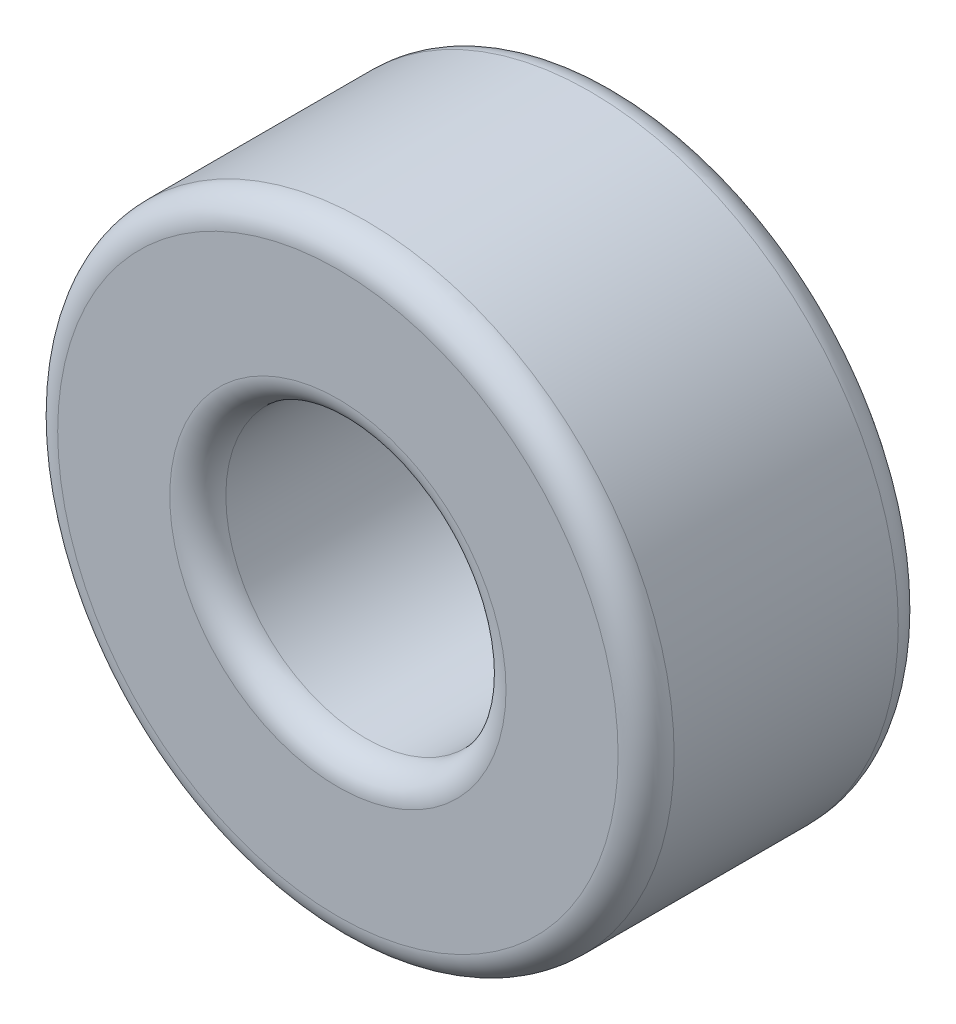
ISO-10303-21;
HEADER;
FILE_DESCRIPTION(('STEP AP214'),'2;1');
FILE_NAME('part.step','',(''),(''),'','','');
FILE_SCHEMA(('AUTOMOTIVE_DESIGN { 1 0 10303 214 1 1 1 1 }'));
ENDSEC;
DATA;
#1=APPLICATION_CONTEXT('core data for automotive mechanical design processes');
#2=APPLICATION_PROTOCOL_DEFINITION('international standard','automotive_design',2000,#1);
#3=PRODUCT_CONTEXT('',#1,'mechanical');
#4=PRODUCT('Part','Part','',(#3));
#5=PRODUCT_RELATED_PRODUCT_CATEGORY('part','',(#4));
#6=PRODUCT_DEFINITION_FORMATION('','',#4);
#7=PRODUCT_DEFINITION_CONTEXT('part definition',#1,'design');
#8=PRODUCT_DEFINITION('design','',#6,#7);
#9=PRODUCT_DEFINITION_SHAPE('','',#8);
#10=(LENGTH_UNIT() NAMED_UNIT(*) SI_UNIT(.MILLI.,.METRE.));
#11=(NAMED_UNIT(*) PLANE_ANGLE_UNIT() SI_UNIT($,.RADIAN.));
#12=(NAMED_UNIT(*) SI_UNIT($,.STERADIAN.) SOLID_ANGLE_UNIT());
#13=UNCERTAINTY_MEASURE_WITH_UNIT(LENGTH_MEASURE(1.E-05),#10,'distance_accuracy_value','');
#14=(GEOMETRIC_REPRESENTATION_CONTEXT(3) GLOBAL_UNCERTAINTY_ASSIGNED_CONTEXT((#13)) GLOBAL_UNIT_ASSIGNED_CONTEXT((#10,
#11,#12)) REPRESENTATION_CONTEXT('',''));
#15=CARTESIAN_POINT('',(0.,0.,0.));
#16=DIRECTION('',(0.,0.,1.));
#17=DIRECTION('',(1.,0.,0.));
#18=AXIS2_PLACEMENT_3D('',#15,#16,#17);
#19=CARTESIAN_POINT('',(0.,0.,5.));
#20=DIRECTION('',(0.,0.,1.));
#21=DIRECTION('',(1.,0.,0.));
#22=AXIS2_PLACEMENT_3D('',#19,#20,#21);
#23=PLANE('',#22);
#24=CARTESIAN_POINT('',(0.,0.,5.));
#25=DIRECTION('',(0.,0.,1.));
#26=DIRECTION('',(1.,0.,0.));
#27=AXIS2_PLACEMENT_3D('',#24,#25,#26);
#28=CIRCLE('',#27,3.);
#29=CARTESIAN_POINT('',(3.,0.,5.));
#30=VERTEX_POINT('',#29);
#31=EDGE_CURVE('E10',#30,#30,#28,.F.);
#32=ORIENTED_EDGE('',*,*,#31,.T.);
#33=EDGE_LOOP('',(#32));
#34=FACE_BOUND('',#33,.T.);
#35=CARTESIAN_POINT('',(0.,0.,5.));
#36=DIRECTION('',(0.,0.,1.));
#37=DIRECTION('',(1.,0.,0.));
#38=AXIS2_PLACEMENT_3D('',#35,#36,#37);
#39=CIRCLE('',#38,5.);
#40=CARTESIAN_POINT('',(5.,0.,5.));
#41=VERTEX_POINT('',#40);
#42=EDGE_CURVE('E39',#41,#41,#39,.T.);
#43=ORIENTED_EDGE('',*,*,#42,.T.);
#44=EDGE_LOOP('',(#43));
#45=FACE_BOUND('',#44,.T.);
#46=ADVANCED_FACE('F32',(#34,#45),#23,.T.);
#47=CARTESIAN_POINT('',(0.,0.,0.));
#48=DIRECTION('',(0.,0.,1.));
#49=DIRECTION('',(1.,0.,0.));
#50=AXIS2_PLACEMENT_3D('',#47,#48,#49);
#51=PLANE('',#50);
#52=CARTESIAN_POINT('',(0.,0.,0.));
#53=DIRECTION('',(0.,0.,1.));
#54=DIRECTION('',(1.,0.,0.));
#55=AXIS2_PLACEMENT_3D('',#52,#53,#54);
#56=CIRCLE('',#55,3.);
#57=CARTESIAN_POINT('',(3.,0.,0.));
#58=VERTEX_POINT('',#57);
#59=EDGE_CURVE('E58',#58,#58,#56,.T.);
#60=ORIENTED_EDGE('',*,*,#59,.T.);
#61=EDGE_LOOP('',(#60));
#62=FACE_BOUND('',#61,.T.);
#63=CARTESIAN_POINT('',(0.,0.,0.));
#64=DIRECTION('',(0.,0.,1.));
#65=DIRECTION('',(1.,0.,0.));
#66=AXIS2_PLACEMENT_3D('',#63,#64,#65);
#67=CIRCLE('',#66,5.);
#68=CARTESIAN_POINT('',(5.,0.,0.));
#69=VERTEX_POINT('',#68);
#70=EDGE_CURVE('E61',#69,#69,#67,.F.);
#71=ORIENTED_EDGE('',*,*,#70,.T.);
#72=EDGE_LOOP('',(#71));
#73=FACE_BOUND('',#72,.T.);
#74=ADVANCED_FACE('F65',(#62,#73),#51,.F.);
#75=CARTESIAN_POINT('',(0.,0.,5.));
#76=DIRECTION('',(0.,0.,-1.));
#77=DIRECTION('',(-1.,0.,0.));
#78=AXIS2_PLACEMENT_3D('',#75,#76,#77);
#79=CYLINDRICAL_SURFACE('',#78,5.5);
#80=CARTESIAN_POINT('',(0.,0.,0.5));
#81=DIRECTION('',(0.,0.,1.));
#82=DIRECTION('',(1.,0.,0.));
#83=AXIS2_PLACEMENT_3D('',#80,#81,#82);
#84=CIRCLE('',#83,5.5);
#85=CARTESIAN_POINT('',(5.5,0.,0.5));
#86=VERTEX_POINT('',#85);
#87=EDGE_CURVE('E43',#86,#86,#84,.T.);
#88=ORIENTED_EDGE('',*,*,#87,.T.);
#89=EDGE_LOOP('',(#88));
#90=FACE_BOUND('',#89,.T.);
#91=CARTESIAN_POINT('',(0.,0.,4.5));
#92=DIRECTION('',(0.,0.,1.));
#93=DIRECTION('',(1.,0.,0.));
#94=AXIS2_PLACEMENT_3D('',#91,#92,#93);
#95=CIRCLE('',#94,5.5);
#96=CARTESIAN_POINT('',(5.5,0.,4.5));
#97=VERTEX_POINT('',#96);
#98=EDGE_CURVE('E47',#97,#97,#95,.F.);
#99=ORIENTED_EDGE('',*,*,#98,.T.);
#100=EDGE_LOOP('',(#99));
#101=FACE_BOUND('',#100,.T.);
#102=ADVANCED_FACE('F75',(#90,#101),#79,.T.);
#103=CARTESIAN_POINT('',(0.,0.,5.));
#104=DIRECTION('',(0.,0.,-1.));
#105=DIRECTION('',(-1.,0.,0.));
#106=AXIS2_PLACEMENT_3D('',#103,#104,#105);
#107=CYLINDRICAL_SURFACE('',#106,2.5);
#108=CARTESIAN_POINT('',(0.,0.,0.5));
#109=DIRECTION('',(0.,0.,1.));
#110=DIRECTION('',(1.,0.,0.));
#111=AXIS2_PLACEMENT_3D('',#108,#109,#110);
#112=CIRCLE('',#111,2.5);
#113=CARTESIAN_POINT('',(2.5,0.,0.5));
#114=VERTEX_POINT('',#113);
#115=EDGE_CURVE('E52',#114,#114,#112,.F.);
#116=ORIENTED_EDGE('',*,*,#115,.T.);
#117=EDGE_LOOP('',(#116));
#118=FACE_BOUND('',#117,.T.);
#119=CARTESIAN_POINT('',(0.,0.,4.5));
#120=DIRECTION('',(0.,0.,1.));
#121=DIRECTION('',(1.,0.,0.));
#122=AXIS2_PLACEMENT_3D('',#119,#120,#121);
#123=CIRCLE('',#122,2.5);
#124=CARTESIAN_POINT('',(2.5,0.,4.5));
#125=VERTEX_POINT('',#124);
#126=EDGE_CURVE('E55',#125,#125,#123,.T.);
#127=ORIENTED_EDGE('',*,*,#126,.T.);
#128=EDGE_LOOP('',(#127));
#129=FACE_BOUND('',#128,.T.);
#130=ADVANCED_FACE('F78',(#118,#129),#107,.F.);
#131=CARTESIAN_POINT('',(0.,0.,0.5));
#132=DIRECTION('',(0.,0.,1.));
#133=DIRECTION('',(1.,0.,0.));
#134=AXIS2_PLACEMENT_3D('',#131,#132,#133);
#135=TOROIDAL_SURFACE('',#134,3.,0.5);
#136=ORIENTED_EDGE('',*,*,#115,.F.);
#137=EDGE_LOOP('',(#136));
#138=FACE_BOUND('',#137,.T.);
#139=ORIENTED_EDGE('',*,*,#59,.F.);
#140=EDGE_LOOP('',(#139));
#141=FACE_BOUND('',#140,.T.);
#142=ADVANCED_FACE('F71',(#138,#141),#135,.T.);
#143=CARTESIAN_POINT('',(0.,0.,0.5));
#144=DIRECTION('',(0.,0.,1.));
#145=DIRECTION('',(1.,0.,0.));
#146=AXIS2_PLACEMENT_3D('',#143,#144,#145);
#147=TOROIDAL_SURFACE('',#146,5.,0.5);
#148=ORIENTED_EDGE('',*,*,#70,.F.);
#149=EDGE_LOOP('',(#148));
#150=FACE_BOUND('',#149,.T.);
#151=ORIENTED_EDGE('',*,*,#87,.F.);
#152=EDGE_LOOP('',(#151));
#153=FACE_BOUND('',#152,.T.);
#154=ADVANCED_FACE('F67',(#150,#153),#147,.T.);
#155=CARTESIAN_POINT('',(0.,0.,4.5));
#156=DIRECTION('',(0.,0.,1.));
#157=DIRECTION('',(1.,0.,0.));
#158=AXIS2_PLACEMENT_3D('',#155,#156,#157);
#159=TOROIDAL_SURFACE('',#158,3.,0.5);
#160=ORIENTED_EDGE('',*,*,#31,.F.);
#161=EDGE_LOOP('',(#160));
#162=FACE_BOUND('',#161,.T.);
#163=ORIENTED_EDGE('',*,*,#126,.F.);
#164=EDGE_LOOP('',(#163));
#165=FACE_BOUND('',#164,.T.);
#166=ADVANCED_FACE('F70',(#162,#165),#159,.T.);
#167=CARTESIAN_POINT('',(0.,0.,4.5));
#168=DIRECTION('',(0.,0.,1.));
#169=DIRECTION('',(1.,0.,0.));
#170=AXIS2_PLACEMENT_3D('',#167,#168,#169);
#171=TOROIDAL_SURFACE('',#170,5.,0.5);
#172=ORIENTED_EDGE('',*,*,#98,.F.);
#173=EDGE_LOOP('',(#172));
#174=FACE_BOUND('',#173,.T.);
#175=ORIENTED_EDGE('',*,*,#42,.F.);
#176=EDGE_LOOP('',(#175));
#177=FACE_BOUND('',#176,.T.);
#178=ADVANCED_FACE('F34',(#174,#177),#171,.T.);
#179=CLOSED_SHELL('',(#46,#74,#102,#130,#142,#154,#166,#178));
#180=MANIFOLD_SOLID_BREP('B2',#179);
#181=ADVANCED_BREP_SHAPE_REPRESENTATION('',(#18,#180),#14);
#182=SHAPE_DEFINITION_REPRESENTATION(#9,#181);
ENDSEC;
END-ISO-10303-21;
